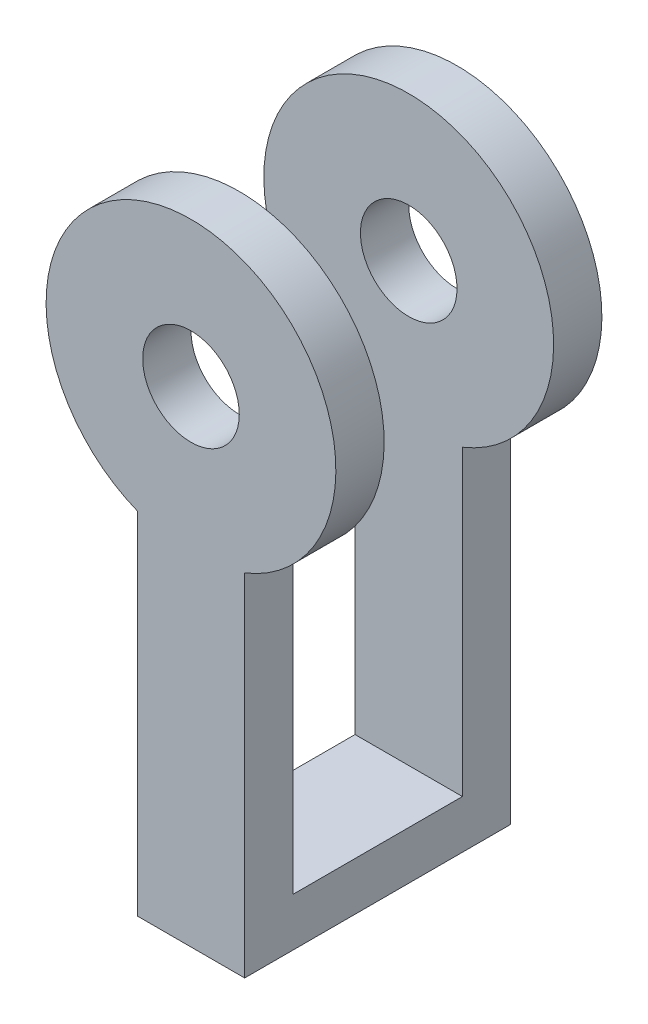
ISO-10303-21;
HEADER;
FILE_DESCRIPTION(('STEP AP214'),'2;1');
FILE_NAME('part.step','',(''),(''),'','','');
FILE_SCHEMA(('AUTOMOTIVE_DESIGN { 1 0 10303 214 1 1 1 1 }'));
ENDSEC;
DATA;
#1=APPLICATION_CONTEXT('core data for automotive mechanical design processes');
#2=APPLICATION_PROTOCOL_DEFINITION('international standard','automotive_design',2000,#1);
#3=PRODUCT_CONTEXT('',#1,'mechanical');
#4=PRODUCT('Part','Part','',(#3));
#5=PRODUCT_RELATED_PRODUCT_CATEGORY('part','',(#4));
#6=PRODUCT_DEFINITION_FORMATION('','',#4);
#7=PRODUCT_DEFINITION_CONTEXT('part definition',#1,'design');
#8=PRODUCT_DEFINITION('design','',#6,#7);
#9=PRODUCT_DEFINITION_SHAPE('','',#8);
#10=(LENGTH_UNIT() NAMED_UNIT(*) SI_UNIT(.MILLI.,.METRE.));
#11=(NAMED_UNIT(*) PLANE_ANGLE_UNIT() SI_UNIT($,.RADIAN.));
#12=(NAMED_UNIT(*) SI_UNIT($,.STERADIAN.) SOLID_ANGLE_UNIT());
#13=UNCERTAINTY_MEASURE_WITH_UNIT(LENGTH_MEASURE(1.E-05),#10,'distance_accuracy_value','');
#14=(GEOMETRIC_REPRESENTATION_CONTEXT(3) GLOBAL_UNCERTAINTY_ASSIGNED_CONTEXT((#13)) GLOBAL_UNIT_ASSIGNED_CONTEXT((#10,
#11,#12)) REPRESENTATION_CONTEXT('',''));
#15=CARTESIAN_POINT('',(0.,0.,0.));
#16=DIRECTION('',(0.,0.,1.));
#17=DIRECTION('',(1.,0.,0.));
#18=AXIS2_PLACEMENT_3D('',#15,#16,#17);
#19=CARTESIAN_POINT('',(-20.,-45.2531458099855,10.9381302617935));
#20=DIRECTION('',(0.,0.,-1.));
#21=DIRECTION('',(-1.,0.,0.));
#22=AXIS2_PLACEMENT_3D('',#19,#20,#21);
#23=PLANE('',#22);
#24=DIRECTION('',(0.,1.,0.));
#25=VECTOR('',#24,1.);
#26=CARTESIAN_POINT('',(5.5576064521285,-13.9324445279089,10.9381302617935));
#27=LINE('',#26,#25);
#28=CARTESIAN_POINT('',(5.5576064521285,-45.2531458099855,10.9381302617935));
#29=VERTEX_POINT('',#28);
#30=CARTESIAN_POINT('',(5.5576064521285,-13.9324445279089,10.9381302617935));
#31=VERTEX_POINT('',#30);
#32=EDGE_CURVE('E103',#29,#31,#27,.T.);
#33=ORIENTED_EDGE('',*,*,#32,.F.);
#34=DIRECTION('',(1.,0.,0.));
#35=VECTOR('',#34,1.);
#36=CARTESIAN_POINT('',(-20.,-45.2531458099855,10.9381302617935));
#37=LINE('',#36,#35);
#38=CARTESIAN_POINT('',(-5.5576064521285,-45.2531458099855,10.9381302617935));
#39=VERTEX_POINT('',#38);
#40=EDGE_CURVE('E55',#39,#29,#37,.T.);
#41=ORIENTED_EDGE('',*,*,#40,.F.);
#42=DIRECTION('',(0.,-1.,0.));
#43=VECTOR('',#42,1.);
#44=CARTESIAN_POINT('',(-5.5576064521285,-13.9324445279089,10.9381302617935));
#45=LINE('',#44,#43);
#46=CARTESIAN_POINT('',(-5.5576064521285,-13.9324445279089,10.9381302617935));
#47=VERTEX_POINT('',#46);
#48=EDGE_CURVE('E157',#47,#39,#45,.T.);
#49=ORIENTED_EDGE('',*,*,#48,.F.);
#50=CARTESIAN_POINT('',(0.,0.,10.9381302617935));
#51=DIRECTION('',(0.,0.,-1.));
#52=DIRECTION('',(-1.,0.,0.));
#53=AXIS2_PLACEMENT_3D('',#50,#51,#52);
#54=CIRCLE('',#53,15.);
#55=EDGE_CURVE('E106',#31,#47,#54,.F.);
#56=ORIENTED_EDGE('',*,*,#55,.F.);
#57=EDGE_LOOP('',(#33,#41,#49,#56));
#58=FACE_BOUND('',#57,.T.);
#59=CARTESIAN_POINT('',(0.,0.,10.9381302617935));
#60=DIRECTION('',(0.,0.,-1.));
#61=DIRECTION('',(-1.,0.,0.));
#62=AXIS2_PLACEMENT_3D('',#59,#60,#61);
#63=CIRCLE('',#62,5.);
#64=CARTESIAN_POINT('',(-5.,0.,10.9381302617935));
#65=VERTEX_POINT('',#64);
#66=EDGE_CURVE('E139',#65,#65,#63,.F.);
#67=ORIENTED_EDGE('',*,*,#66,.T.);
#68=EDGE_LOOP('',(#67));
#69=FACE_BOUND('',#68,.T.);
#70=ADVANCED_FACE('F40',(#58,#69),#23,.T.);
#71=CARTESIAN_POINT('',(-20.,-45.2531458099855,-6.6055019568257));
#72=DIRECTION('',(0.,0.,1.));
#73=DIRECTION('',(1.,0.,0.));
#74=AXIS2_PLACEMENT_3D('',#71,#72,#73);
#75=PLANE('',#74);
#76=DIRECTION('',(0.,-1.,0.));
#77=VECTOR('',#76,1.);
#78=CARTESIAN_POINT('',(5.5576064521285,-13.9324445279089,-6.6055019568257));
#79=LINE('',#78,#77);
#80=CARTESIAN_POINT('',(5.5576064521285,-13.9324445279089,-6.6055019568257));
#81=VERTEX_POINT('',#80);
#82=CARTESIAN_POINT('',(5.5576064521285,-45.2531458099855,-6.6055019568257));
#83=VERTEX_POINT('',#82);
#84=EDGE_CURVE('E126',#81,#83,#79,.T.);
#85=ORIENTED_EDGE('',*,*,#84,.F.);
#86=CARTESIAN_POINT('',(0.,0.,-6.6055019568257));
#87=DIRECTION('',(0.,0.,1.));
#88=DIRECTION('',(1.,0.,0.));
#89=AXIS2_PLACEMENT_3D('',#86,#87,#88);
#90=CIRCLE('',#89,15.);
#91=CARTESIAN_POINT('',(-5.5576064521285,-13.9324445279089,-6.6055019568257));
#92=VERTEX_POINT('',#91);
#93=EDGE_CURVE('E180',#92,#81,#90,.F.);
#94=ORIENTED_EDGE('',*,*,#93,.F.);
#95=DIRECTION('',(0.,1.,0.));
#96=VECTOR('',#95,1.);
#97=CARTESIAN_POINT('',(-5.5576064521285,-13.9324445279089,-6.6055019568257));
#98=LINE('',#97,#96);
#99=CARTESIAN_POINT('',(-5.5576064521285,-45.2531458099855,-6.6055019568257));
#100=VERTEX_POINT('',#99);
#101=EDGE_CURVE('E154',#100,#92,#98,.T.);
#102=ORIENTED_EDGE('',*,*,#101,.F.);
#103=DIRECTION('',(1.,0.,0.));
#104=VECTOR('',#103,1.);
#105=CARTESIAN_POINT('',(-20.,-45.2531458099855,-6.6055019568257));
#106=LINE('',#105,#104);
#107=EDGE_CURVE('E158',#100,#83,#106,.T.);
#108=ORIENTED_EDGE('',*,*,#107,.T.);
#109=EDGE_LOOP('',(#85,#94,#102,#108));
#110=FACE_BOUND('',#109,.T.);
#111=CARTESIAN_POINT('',(0.,0.,-6.6055019568257));
#112=DIRECTION('',(0.,0.,1.));
#113=DIRECTION('',(1.,0.,0.));
#114=AXIS2_PLACEMENT_3D('',#111,#112,#113);
#115=CIRCLE('',#114,5.);
#116=CARTESIAN_POINT('',(5.,0.,-6.6055019568257));
#117=VERTEX_POINT('',#116);
#118=EDGE_CURVE('E148',#117,#117,#115,.F.);
#119=ORIENTED_EDGE('',*,*,#118,.T.);
#120=EDGE_LOOP('',(#119));
#121=FACE_BOUND('',#120,.T.);
#122=ADVANCED_FACE('F206',(#110,#121),#75,.T.);
#123=CARTESIAN_POINT('',(-20.,-45.2531458099855,-6.6055019568257));
#124=DIRECTION('',(0.,1.,0.));
#125=DIRECTION('',(0.,0.,1.));
#126=AXIS2_PLACEMENT_3D('',#123,#124,#125);
#127=PLANE('',#126);
#128=DIRECTION('',(0.,0.,1.));
#129=VECTOR('',#128,1.);
#130=CARTESIAN_POINT('',(5.5576064521285,-45.2531458099855,-30.));
#131=LINE('',#130,#129);
#132=EDGE_CURVE('E116',#83,#29,#131,.T.);
#133=ORIENTED_EDGE('',*,*,#132,.F.);
#134=ORIENTED_EDGE('',*,*,#107,.F.);
#135=DIRECTION('',(0.,0.,-1.));
#136=VECTOR('',#135,1.);
#137=CARTESIAN_POINT('',(-5.5576064521285,-45.2531458099855,-30.));
#138=LINE('',#137,#136);
#139=EDGE_CURVE('E48',#39,#100,#138,.T.);
#140=ORIENTED_EDGE('',*,*,#139,.F.);
#141=ORIENTED_EDGE('',*,*,#40,.T.);
#142=EDGE_LOOP('',(#133,#134,#140,#141));
#143=FACE_BOUND('',#142,.T.);
#144=ADVANCED_FACE('F114',(#143),#127,.T.);
#145=CARTESIAN_POINT('',(0.,0.,-30.));
#146=DIRECTION('',(0.,0.,1.));
#147=DIRECTION('',(1.,0.,0.));
#148=AXIS2_PLACEMENT_3D('',#145,#146,#147);
#149=CYLINDRICAL_SURFACE('',#148,5.);
#150=CARTESIAN_POINT('',(0.,0.,15.9381302617935));
#151=DIRECTION('',(0.,0.,1.));
#152=DIRECTION('',(1.,0.,0.));
#153=AXIS2_PLACEMENT_3D('',#150,#151,#152);
#154=CIRCLE('',#153,5.);
#155=CARTESIAN_POINT('',(5.,0.,15.9381302617935));
#156=VERTEX_POINT('',#155);
#157=EDGE_CURVE('E142',#156,#156,#154,.F.);
#158=ORIENTED_EDGE('',*,*,#157,.F.);
#159=EDGE_LOOP('',(#158));
#160=FACE_BOUND('',#159,.T.);
#161=ORIENTED_EDGE('',*,*,#66,.F.);
#162=EDGE_LOOP('',(#161));
#163=FACE_BOUND('',#162,.T.);
#164=ADVANCED_FACE('F216',(#160,#163),#149,.F.);
#165=CARTESIAN_POINT('',(-20.,-50.2531458099855,-11.6055019568257));
#166=DIRECTION('',(0.,0.,-1.));
#167=DIRECTION('',(-1.,0.,0.));
#168=AXIS2_PLACEMENT_3D('',#165,#166,#167);
#169=PLANE('',#168);
#170=DIRECTION('',(0.,1.,0.));
#171=VECTOR('',#170,1.);
#172=CARTESIAN_POINT('',(5.5576064521285,-13.9324445279089,-11.6055019568257));
#173=LINE('',#172,#171);
#174=CARTESIAN_POINT('',(5.5576064521285,-50.2531458099855,-11.6055019568257));
#175=VERTEX_POINT('',#174);
#176=CARTESIAN_POINT('',(5.5576064521285,-13.9324445279089,-11.6055019568257));
#177=VERTEX_POINT('',#176);
#178=EDGE_CURVE('E176',#175,#177,#173,.T.);
#179=ORIENTED_EDGE('',*,*,#178,.F.);
#180=DIRECTION('',(1.,0.,0.));
#181=VECTOR('',#180,1.);
#182=CARTESIAN_POINT('',(-20.,-50.2531458099855,-11.6055019568257));
#183=LINE('',#182,#181);
#184=CARTESIAN_POINT('',(-5.5576064521285,-50.2531458099855,-11.6055019568257));
#185=VERTEX_POINT('',#184);
#186=EDGE_CURVE('E161',#185,#175,#183,.T.);
#187=ORIENTED_EDGE('',*,*,#186,.F.);
#188=DIRECTION('',(0.,-1.,0.));
#189=VECTOR('',#188,1.);
#190=CARTESIAN_POINT('',(-5.5576064521285,-13.9324445279089,-11.6055019568257));
#191=LINE('',#190,#189);
#192=CARTESIAN_POINT('',(-5.5576064521285,-13.9324445279089,-11.6055019568257));
#193=VERTEX_POINT('',#192);
#194=EDGE_CURVE('E170',#193,#185,#191,.T.);
#195=ORIENTED_EDGE('',*,*,#194,.F.);
#196=CARTESIAN_POINT('',(0.,0.,-11.6055019568257));
#197=DIRECTION('',(0.,0.,-1.));
#198=DIRECTION('',(-1.,0.,0.));
#199=AXIS2_PLACEMENT_3D('',#196,#197,#198);
#200=CIRCLE('',#199,15.);
#201=EDGE_CURVE('E173',#177,#193,#200,.F.);
#202=ORIENTED_EDGE('',*,*,#201,.F.);
#203=EDGE_LOOP('',(#179,#187,#195,#202));
#204=FACE_BOUND('',#203,.T.);
#205=CARTESIAN_POINT('',(0.,0.,-11.6055019568257));
#206=DIRECTION('',(0.,0.,-1.));
#207=DIRECTION('',(-1.,0.,0.));
#208=AXIS2_PLACEMENT_3D('',#205,#206,#207);
#209=CIRCLE('',#208,5.);
#210=CARTESIAN_POINT('',(-5.,0.,-11.6055019568257));
#211=VERTEX_POINT('',#210);
#212=EDGE_CURVE('E145',#211,#211,#209,.F.);
#213=ORIENTED_EDGE('',*,*,#212,.T.);
#214=EDGE_LOOP('',(#213));
#215=FACE_BOUND('',#214,.T.);
#216=ADVANCED_FACE('F189',(#204,#215),#169,.T.);
#217=CARTESIAN_POINT('',(-20.,-50.2531458099855,15.9381302617935));
#218=DIRECTION('',(0.,0.,1.));
#219=DIRECTION('',(1.,0.,0.));
#220=AXIS2_PLACEMENT_3D('',#217,#218,#219);
#221=PLANE('',#220);
#222=DIRECTION('',(0.,-1.,0.));
#223=VECTOR('',#222,1.);
#224=CARTESIAN_POINT('',(5.5576064521285,-13.9324445279089,15.9381302617935));
#225=LINE('',#224,#223);
#226=CARTESIAN_POINT('',(5.5576064521285,-13.9324445279089,15.9381302617935));
#227=VERTEX_POINT('',#226);
#228=CARTESIAN_POINT('',(5.5576064521285,-50.2531458099855,15.9381302617935));
#229=VERTEX_POINT('',#228);
#230=EDGE_CURVE('E167',#227,#229,#225,.T.);
#231=ORIENTED_EDGE('',*,*,#230,.F.);
#232=CARTESIAN_POINT('',(0.,0.,15.9381302617935));
#233=DIRECTION('',(0.,0.,1.));
#234=DIRECTION('',(1.,0.,0.));
#235=AXIS2_PLACEMENT_3D('',#232,#233,#234);
#236=CIRCLE('',#235,15.);
#237=CARTESIAN_POINT('',(-5.5576064521285,-13.9324445279089,15.9381302617935));
#238=VERTEX_POINT('',#237);
#239=EDGE_CURVE('E63',#238,#227,#236,.F.);
#240=ORIENTED_EDGE('',*,*,#239,.F.);
#241=DIRECTION('',(0.,1.,0.));
#242=VECTOR('',#241,1.);
#243=CARTESIAN_POINT('',(-5.5576064521285,-13.9324445279089,15.9381302617935));
#244=LINE('',#243,#242);
#245=CARTESIAN_POINT('',(-5.5576064521285,-50.2531458099855,15.9381302617935));
#246=VERTEX_POINT('',#245);
#247=EDGE_CURVE('E111',#246,#238,#244,.T.);
#248=ORIENTED_EDGE('',*,*,#247,.F.);
#249=DIRECTION('',(1.,0.,0.));
#250=VECTOR('',#249,1.);
#251=CARTESIAN_POINT('',(-20.,-50.2531458099855,15.9381302617935));
#252=LINE('',#251,#250);
#253=EDGE_CURVE('E120',#246,#229,#252,.T.);
#254=ORIENTED_EDGE('',*,*,#253,.T.);
#255=EDGE_LOOP('',(#231,#240,#248,#254));
#256=FACE_BOUND('',#255,.T.);
#257=ORIENTED_EDGE('',*,*,#157,.T.);
#258=EDGE_LOOP('',(#257));
#259=FACE_BOUND('',#258,.T.);
#260=ADVANCED_FACE('F196',(#256,#259),#221,.T.);
#261=CARTESIAN_POINT('',(-20.,-50.2531458099855,-11.6055019568257));
#262=DIRECTION('',(0.,-1.,0.));
#263=DIRECTION('',(0.,0.,-1.));
#264=AXIS2_PLACEMENT_3D('',#261,#262,#263);
#265=PLANE('',#264);
#266=DIRECTION('',(0.,0.,-1.));
#267=VECTOR('',#266,1.);
#268=CARTESIAN_POINT('',(5.5576064521285,-50.2531458099855,-30.));
#269=LINE('',#268,#267);
#270=EDGE_CURVE('E128',#229,#175,#269,.T.);
#271=ORIENTED_EDGE('',*,*,#270,.F.);
#272=ORIENTED_EDGE('',*,*,#253,.F.);
#273=DIRECTION('',(0.,0.,1.));
#274=VECTOR('',#273,1.);
#275=CARTESIAN_POINT('',(-5.5576064521285,-50.2531458099855,-30.));
#276=LINE('',#275,#274);
#277=EDGE_CURVE('E11',#185,#246,#276,.T.);
#278=ORIENTED_EDGE('',*,*,#277,.F.);
#279=ORIENTED_EDGE('',*,*,#186,.T.);
#280=EDGE_LOOP('',(#271,#272,#278,#279));
#281=FACE_BOUND('',#280,.T.);
#282=ADVANCED_FACE('F192',(#281),#265,.T.);
#283=ORIENTED_EDGE('',*,*,#118,.F.);
#284=EDGE_LOOP('',(#283));
#285=FACE_BOUND('',#284,.T.);
#286=ORIENTED_EDGE('',*,*,#212,.F.);
#287=EDGE_LOOP('',(#286));
#288=FACE_BOUND('',#287,.T.);
#289=ADVANCED_FACE('F204',(#285,#288),#149,.F.);
#290=CARTESIAN_POINT('',(0.,0.,-30.));
#291=DIRECTION('',(0.,0.,1.));
#292=DIRECTION('',(1.,0.,0.));
#293=AXIS2_PLACEMENT_3D('',#290,#291,#292);
#294=CYLINDRICAL_SURFACE('',#293,15.);
#295=DIRECTION('',(0.,0.,1.));
#296=VECTOR('',#295,1.);
#297=CARTESIAN_POINT('',(-5.5576064521285,-13.9324445279089,-30.));
#298=LINE('',#297,#296);
#299=EDGE_CURVE('E131',#193,#92,#298,.T.);
#300=ORIENTED_EDGE('',*,*,#299,.T.);
#301=ORIENTED_EDGE('',*,*,#93,.T.);
#302=DIRECTION('',(0.,0.,1.));
#303=VECTOR('',#302,1.);
#304=CARTESIAN_POINT('',(5.5576064521285,-13.9324445279089,-30.));
#305=LINE('',#304,#303);
#306=EDGE_CURVE('E137',#177,#81,#305,.T.);
#307=ORIENTED_EDGE('',*,*,#306,.F.);
#308=ORIENTED_EDGE('',*,*,#201,.T.);
#309=EDGE_LOOP('',(#300,#301,#307,#308));
#310=FACE_BOUND('',#309,.T.);
#311=ADVANCED_FACE('F184',(#310),#294,.T.);
#312=EDGE_CURVE('E127',#47,#238,#298,.T.);
#313=ORIENTED_EDGE('',*,*,#312,.T.);
#314=ORIENTED_EDGE('',*,*,#239,.T.);
#315=EDGE_CURVE('E136',#31,#227,#305,.T.);
#316=ORIENTED_EDGE('',*,*,#315,.F.);
#317=ORIENTED_EDGE('',*,*,#55,.T.);
#318=EDGE_LOOP('',(#313,#314,#316,#317));
#319=FACE_BOUND('',#318,.T.);
#320=ADVANCED_FACE('F42',(#319),#294,.T.);
#321=CARTESIAN_POINT('',(5.5576064521285,-13.9324445279089,-30.));
#322=DIRECTION('',(1.,0.,0.));
#323=DIRECTION('',(0.,1.,0.));
#324=AXIS2_PLACEMENT_3D('',#321,#322,#323);
#325=PLANE('',#324);
#326=ORIENTED_EDGE('',*,*,#270,.T.);
#327=ORIENTED_EDGE('',*,*,#178,.T.);
#328=ORIENTED_EDGE('',*,*,#306,.T.);
#329=ORIENTED_EDGE('',*,*,#84,.T.);
#330=ORIENTED_EDGE('',*,*,#132,.T.);
#331=ORIENTED_EDGE('',*,*,#32,.T.);
#332=ORIENTED_EDGE('',*,*,#315,.T.);
#333=ORIENTED_EDGE('',*,*,#230,.T.);
#334=EDGE_LOOP('',(#326,#327,#328,#329,#330,#331,#332,#333));
#335=FACE_BOUND('',#334,.T.);
#336=ADVANCED_FACE('F124',(#335),#325,.T.);
#337=CARTESIAN_POINT('',(-5.5576064521285,-13.9324445279089,-30.));
#338=DIRECTION('',(-1.,0.,0.));
#339=DIRECTION('',(0.,0.,1.));
#340=AXIS2_PLACEMENT_3D('',#337,#338,#339);
#341=PLANE('',#340);
#342=ORIENTED_EDGE('',*,*,#299,.F.);
#343=ORIENTED_EDGE('',*,*,#194,.T.);
#344=ORIENTED_EDGE('',*,*,#277,.T.);
#345=ORIENTED_EDGE('',*,*,#247,.T.);
#346=ORIENTED_EDGE('',*,*,#312,.F.);
#347=ORIENTED_EDGE('',*,*,#48,.T.);
#348=ORIENTED_EDGE('',*,*,#139,.T.);
#349=ORIENTED_EDGE('',*,*,#101,.T.);
#350=EDGE_LOOP('',(#342,#343,#344,#345,#346,#347,#348,#349));
#351=FACE_BOUND('',#350,.T.);
#352=ADVANCED_FACE('F153',(#351),#341,.T.);
#353=CLOSED_SHELL('',(#70,#122,#144,#164,#216,#260,#282,#289,#311,#320,#336,#352));
#354=MANIFOLD_SOLID_BREP('B2',#353);
#355=ADVANCED_BREP_SHAPE_REPRESENTATION('',(#18,#354),#14);
#356=SHAPE_DEFINITION_REPRESENTATION(#9,#355);
ENDSEC;
END-ISO-10303-21;
